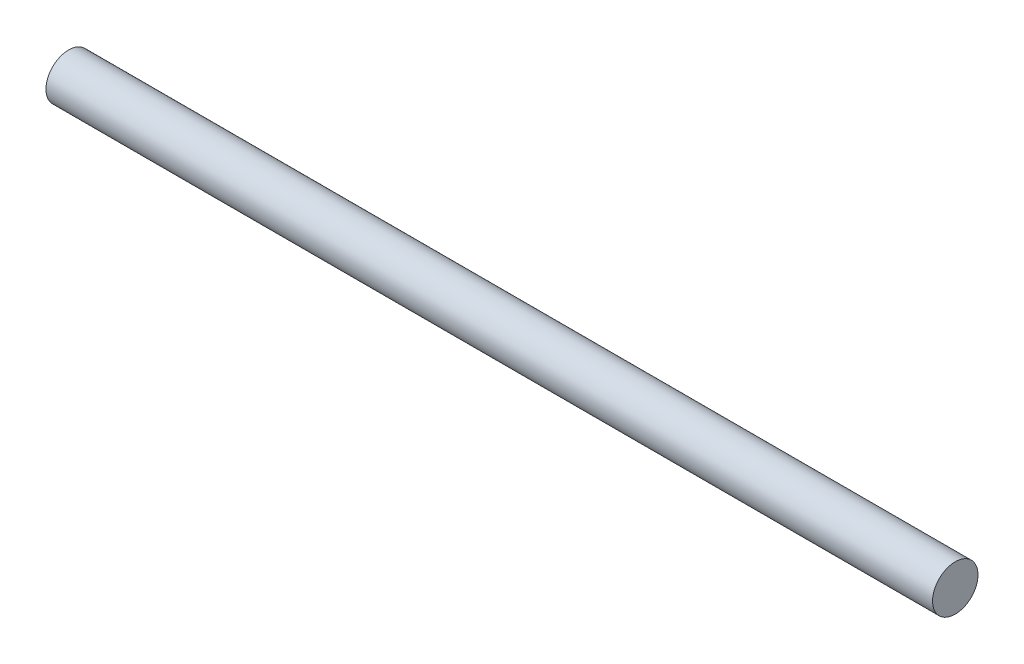
ISO-10303-21;
HEADER;
FILE_DESCRIPTION(('STEP AP214'),'2;1');
FILE_NAME('part.step','',(''),(''),'','','');
FILE_SCHEMA(('AUTOMOTIVE_DESIGN { 1 0 10303 214 1 1 1 1 }'));
ENDSEC;
DATA;
#1=APPLICATION_CONTEXT('core data for automotive mechanical design processes');
#2=APPLICATION_PROTOCOL_DEFINITION('international standard','automotive_design',2000,#1);
#3=PRODUCT_CONTEXT('',#1,'mechanical');
#4=PRODUCT('Part','Part','',(#3));
#5=PRODUCT_RELATED_PRODUCT_CATEGORY('part','',(#4));
#6=PRODUCT_DEFINITION_FORMATION('','',#4);
#7=PRODUCT_DEFINITION_CONTEXT('part definition',#1,'design');
#8=PRODUCT_DEFINITION('design','',#6,#7);
#9=PRODUCT_DEFINITION_SHAPE('','',#8);
#10=(LENGTH_UNIT() NAMED_UNIT(*) SI_UNIT(.MILLI.,.METRE.));
#11=(NAMED_UNIT(*) PLANE_ANGLE_UNIT() SI_UNIT($,.RADIAN.));
#12=(NAMED_UNIT(*) SI_UNIT($,.STERADIAN.) SOLID_ANGLE_UNIT());
#13=UNCERTAINTY_MEASURE_WITH_UNIT(LENGTH_MEASURE(1.E-05),#10,'distance_accuracy_value','');
#14=(GEOMETRIC_REPRESENTATION_CONTEXT(3) GLOBAL_UNCERTAINTY_ASSIGNED_CONTEXT((#13)) GLOBAL_UNIT_ASSIGNED_CONTEXT((#10,
#11,#12)) REPRESENTATION_CONTEXT('',''));
#15=CARTESIAN_POINT('',(0.,0.,0.));
#16=DIRECTION('',(0.,0.,1.));
#17=DIRECTION('',(1.,0.,0.));
#18=AXIS2_PLACEMENT_3D('',#15,#16,#17);
#19=CARTESIAN_POINT('',(-28.,0.,0.));
#20=DIRECTION('',(-1.,0.,0.));
#21=DIRECTION('',(0.,0.,1.));
#22=AXIS2_PLACEMENT_3D('',#19,#20,#21);
#23=PLANE('',#22);
#24=CARTESIAN_POINT('',(-28.,0.,0.));
#25=DIRECTION('',(1.,0.,0.));
#26=DIRECTION('',(0.,0.,-1.));
#27=AXIS2_PLACEMENT_3D('',#24,#25,#26);
#28=CIRCLE('',#27,2.);
#29=CARTESIAN_POINT('',(-28.,0.,-2.));
#30=VERTEX_POINT('',#29);
#31=EDGE_CURVE('E18',#30,#30,#28,.T.);
#32=ORIENTED_EDGE('',*,*,#31,.F.);
#33=EDGE_LOOP('',(#32));
#34=FACE_BOUND('',#33,.T.);
#35=ADVANCED_FACE('F15',(#34),#23,.T.);
#36=CARTESIAN_POINT('',(50.,0.,0.));
#37=DIRECTION('',(1.,0.,0.));
#38=DIRECTION('',(0.,0.,-1.));
#39=AXIS2_PLACEMENT_3D('',#36,#37,#38);
#40=PLANE('',#39);
#41=CARTESIAN_POINT('',(50.,0.,0.));
#42=DIRECTION('',(1.,0.,0.));
#43=DIRECTION('',(0.,0.,-1.));
#44=AXIS2_PLACEMENT_3D('',#41,#42,#43);
#45=CIRCLE('',#44,2.);
#46=CARTESIAN_POINT('',(50.,0.,-2.));
#47=VERTEX_POINT('',#46);
#48=EDGE_CURVE('E10',#47,#47,#45,.F.);
#49=ORIENTED_EDGE('',*,*,#48,.F.);
#50=EDGE_LOOP('',(#49));
#51=FACE_BOUND('',#50,.T.);
#52=ADVANCED_FACE('F33',(#51),#40,.T.);
#53=CARTESIAN_POINT('',(50.,0.,0.));
#54=DIRECTION('',(1.,0.,0.));
#55=DIRECTION('',(0.,0.,-1.));
#56=AXIS2_PLACEMENT_3D('',#53,#54,#55);
#57=CYLINDRICAL_SURFACE('',#56,2.);
#58=ORIENTED_EDGE('',*,*,#48,.T.);
#59=EDGE_LOOP('',(#58));
#60=FACE_BOUND('',#59,.T.);
#61=ORIENTED_EDGE('',*,*,#31,.T.);
#62=EDGE_LOOP('',(#61));
#63=FACE_BOUND('',#62,.T.);
#64=ADVANCED_FACE('F30',(#60,#63),#57,.T.);
#65=CLOSED_SHELL('',(#35,#52,#64));
#66=MANIFOLD_SOLID_BREP('B1',#65);
#67=ADVANCED_BREP_SHAPE_REPRESENTATION('',(#18,#66),#14);
#68=SHAPE_DEFINITION_REPRESENTATION(#9,#67);
ENDSEC;
END-ISO-10303-21;
